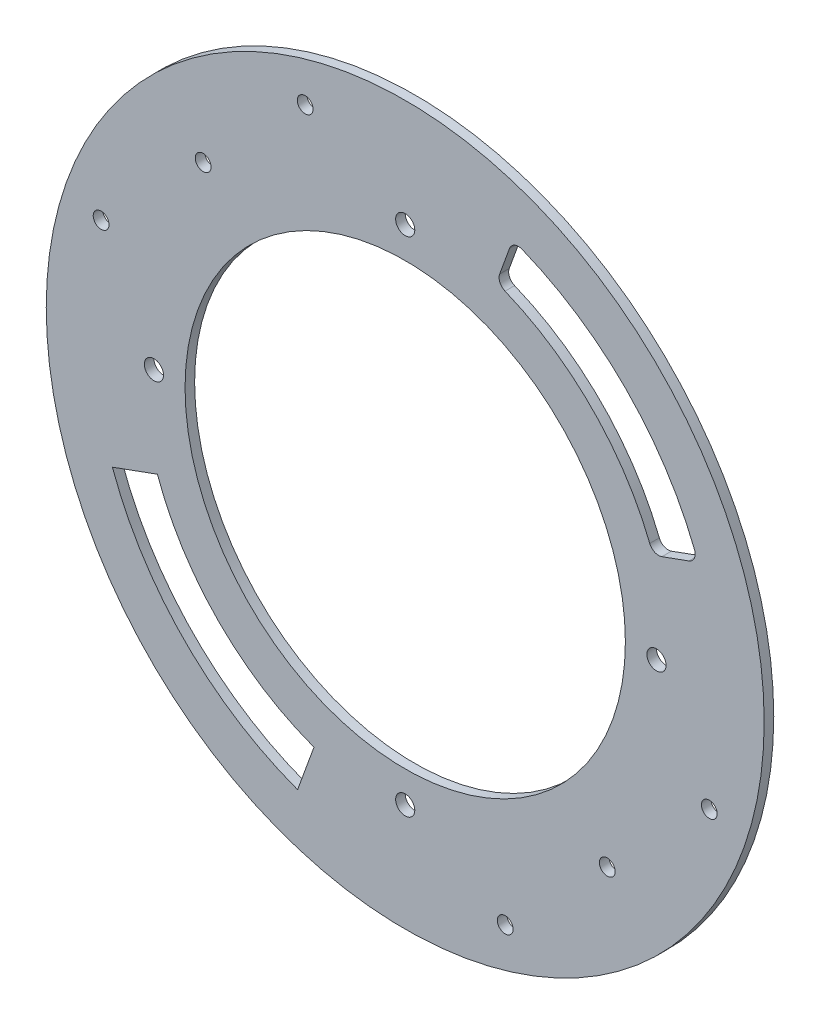
ISO-10303-21;
HEADER;
FILE_DESCRIPTION(('STEP AP214'),'2;1');
FILE_NAME('part.step','',(''),(''),'','','');
FILE_SCHEMA(('AUTOMOTIVE_DESIGN { 1 0 10303 214 1 1 1 1 }'));
ENDSEC;
DATA;
#1=APPLICATION_CONTEXT('core data for automotive mechanical design processes');
#2=APPLICATION_PROTOCOL_DEFINITION('international standard','automotive_design',2000,#1);
#3=PRODUCT_CONTEXT('',#1,'mechanical');
#4=PRODUCT('Part','Part','',(#3));
#5=PRODUCT_RELATED_PRODUCT_CATEGORY('part','',(#4));
#6=PRODUCT_DEFINITION_FORMATION('','',#4);
#7=PRODUCT_DEFINITION_CONTEXT('part definition',#1,'design');
#8=PRODUCT_DEFINITION('design','',#6,#7);
#9=PRODUCT_DEFINITION_SHAPE('','',#8);
#10=(LENGTH_UNIT() NAMED_UNIT(*) SI_UNIT(.MILLI.,.METRE.));
#11=(NAMED_UNIT(*) PLANE_ANGLE_UNIT() SI_UNIT($,.RADIAN.));
#12=(NAMED_UNIT(*) SI_UNIT($,.STERADIAN.) SOLID_ANGLE_UNIT());
#13=UNCERTAINTY_MEASURE_WITH_UNIT(LENGTH_MEASURE(1.E-05),#10,'distance_accuracy_value','');
#14=(GEOMETRIC_REPRESENTATION_CONTEXT(3) GLOBAL_UNCERTAINTY_ASSIGNED_CONTEXT((#13)) GLOBAL_UNIT_ASSIGNED_CONTEXT((#10,
#11,#12)) REPRESENTATION_CONTEXT('',''));
#15=CARTESIAN_POINT('',(0.,0.,0.));
#16=DIRECTION('',(0.,0.,1.));
#17=DIRECTION('',(1.,0.,0.));
#18=AXIS2_PLACEMENT_3D('',#15,#16,#17);
#19=CARTESIAN_POINT('',(0.,0.,2.));
#20=DIRECTION('',(0.,0.,1.));
#21=DIRECTION('',(1.,0.,0.));
#22=AXIS2_PLACEMENT_3D('',#19,#20,#21);
#23=PLANE('',#22);
#24=CARTESIAN_POINT('',(63.5341276300229,-21.5270672942682,2.));
#25=DIRECTION('',(0.,0.,1.));
#26=DIRECTION('',(-1.,0.,0.));
#27=AXIS2_PLACEMENT_3D('',#24,#25,#26);
#28=CIRCLE('',#27,1.64999999999999);
#29=CARTESIAN_POINT('',(61.884127630023,-21.5270672942682,2.));
#30=VERTEX_POINT('',#29);
#31=EDGE_CURVE('E232',#30,#30,#28,.T.);
#32=ORIENTED_EDGE('',*,*,#31,.F.);
#33=EDGE_LOOP('',(#32));
#34=FACE_BOUND('',#33,.T.);
#35=CARTESIAN_POINT('',(-63.5341276300229,21.5270672942682,2.));
#36=DIRECTION('',(0.,0.,1.));
#37=DIRECTION('',(1.,0.,0.));
#38=AXIS2_PLACEMENT_3D('',#35,#36,#37);
#39=CIRCLE('',#38,1.65);
#40=CARTESIAN_POINT('',(-61.8841276300229,21.5270672942682,2.));
#41=VERTEX_POINT('',#40);
#42=EDGE_CURVE('E590',#41,#41,#39,.T.);
#43=ORIENTED_EDGE('',*,*,#42,.F.);
#44=EDGE_LOOP('',(#43));
#45=FACE_BOUND('',#44,.T.);
#46=CARTESIAN_POINT('',(-42.2164751863111,42.6353048874238,2.));
#47=DIRECTION('',(0.,0.,1.));
#48=DIRECTION('',(1.,0.,0.));
#49=AXIS2_PLACEMENT_3D('',#46,#47,#48);
#50=CIRCLE('',#49,1.65);
#51=CARTESIAN_POINT('',(-40.5664751863111,42.6353048874238,2.));
#52=VERTEX_POINT('',#51);
#53=EDGE_CURVE('E587',#52,#52,#50,.T.);
#54=ORIENTED_EDGE('',*,*,#53,.F.);
#55=EDGE_LOOP('',(#54));
#56=FACE_BOUND('',#55,.T.);
#57=CARTESIAN_POINT('',(-20.8988227425992,63.7435424805793,2.));
#58=DIRECTION('',(0.,0.,1.));
#59=DIRECTION('',(1.,0.,0.));
#60=AXIS2_PLACEMENT_3D('',#57,#58,#59);
#61=CIRCLE('',#60,1.65);
#62=CARTESIAN_POINT('',(-19.2488227425992,63.7435424805793,2.));
#63=VERTEX_POINT('',#62);
#64=EDGE_CURVE('E584',#63,#63,#61,.T.);
#65=ORIENTED_EDGE('',*,*,#64,.F.);
#66=EDGE_LOOP('',(#65));
#67=FACE_BOUND('',#66,.T.);
#68=CARTESIAN_POINT('',(42.2164751863111,-42.6353048874238,2.));
#69=DIRECTION('',(0.,0.,1.));
#70=DIRECTION('',(-1.,0.,0.));
#71=AXIS2_PLACEMENT_3D('',#68,#69,#70);
#72=CIRCLE('',#71,1.65000000000001);
#73=CARTESIAN_POINT('',(40.566475186311,-42.6353048874238,2.));
#74=VERTEX_POINT('',#73);
#75=EDGE_CURVE('E581',#74,#74,#72,.T.);
#76=ORIENTED_EDGE('',*,*,#75,.F.);
#77=EDGE_LOOP('',(#76));
#78=FACE_BOUND('',#77,.T.);
#79=CARTESIAN_POINT('',(20.8988227425991,-63.7435424805793,2.));
#80=DIRECTION('',(0.,0.,1.));
#81=DIRECTION('',(-1.,0.,0.));
#82=AXIS2_PLACEMENT_3D('',#79,#80,#81);
#83=CIRCLE('',#82,1.65000000000001);
#84=CARTESIAN_POINT('',(19.2488227425991,-63.7435424805793,2.));
#85=VERTEX_POINT('',#84);
#86=EDGE_CURVE('E578',#85,#85,#83,.T.);
#87=ORIENTED_EDGE('',*,*,#86,.F.);
#88=EDGE_LOOP('',(#87));
#89=FACE_BOUND('',#88,.T.);
#90=CARTESIAN_POINT('',(0.,0.,2.));
#91=DIRECTION('',(0.,0.,-1.));
#92=DIRECTION('',(1.,0.,0.));
#93=AXIS2_PLACEMENT_3D('',#90,#91,#92);
#94=CIRCLE('',#93,55.);
#95=CARTESIAN_POINT('',(-19.0641631105005,-51.5902867301223,2.));
#96=VERTEX_POINT('',#95);
#97=CARTESIAN_POINT('',(-51.7759702978787,-18.5539456642836,2.));
#98=VERTEX_POINT('',#97);
#99=EDGE_CURVE('E147',#96,#98,#94,.T.);
#100=ORIENTED_EDGE('',*,*,#99,.F.);
#101=DIRECTION('',(0.342020143325669,0.939692620785908,0.));
#102=VECTOR('',#101,1.);
#103=CARTESIAN_POINT('',(-19.0641631105005,-51.5902867301223,2.));
#104=LINE('',#103,#102);
#105=CARTESIAN_POINT('',(-22.4843992962783,-60.9873084197485,2.));
#106=VERTEX_POINT('',#105);
#107=EDGE_CURVE('E151',#106,#96,#104,.T.);
#108=ORIENTED_EDGE('',*,*,#107,.F.);
#109=CARTESIAN_POINT('',(0.,0.,2.));
#110=DIRECTION('',(0.,0.,1.));
#111=DIRECTION('',(1.,0.,0.));
#112=AXIS2_PLACEMENT_3D('',#109,#110,#111);
#113=CIRCLE('',#112,65.);
#114=CARTESIAN_POINT('',(-61.1729947583006,-21.9741828585486,2.));
#115=VERTEX_POINT('',#114);
#116=EDGE_CURVE('E131',#115,#106,#113,.T.);
#117=ORIENTED_EDGE('',*,*,#116,.F.);
#118=DIRECTION('',(-0.939692620785908,-0.342020143325669,0.));
#119=VECTOR('',#118,1.);
#120=CARTESIAN_POINT('',(-51.7759702978787,-18.5539456642836,2.));
#121=LINE('',#120,#119);
#122=EDGE_CURVE('E142',#98,#115,#121,.T.);
#123=ORIENTED_EDGE('',*,*,#122,.F.);
#124=EDGE_LOOP('',(#100,#108,#117,#123));
#125=FACE_BOUND('',#124,.T.);
#126=CARTESIAN_POINT('',(0.,0.,2.));
#127=DIRECTION('',(0.,0.,-1.));
#128=DIRECTION('',(1.,0.,0.));
#129=AXIS2_PLACEMENT_3D('',#126,#127,#128);
#130=CIRCLE('',#129,55.);
#131=CARTESIAN_POINT('',(20.8540268561821,50.8931190229253,2.));
#132=VERTEX_POINT('',#131);
#133=CARTESIAN_POINT('',(51.0895727877265,20.3680031512074,2.));
#134=VERTEX_POINT('',#133);
#135=EDGE_CURVE('E161',#132,#134,#130,.T.);
#136=ORIENTED_EDGE('',*,*,#135,.F.);
#137=CARTESIAN_POINT('',(21.6123551054978,52.7437778964862,2.));
#138=DIRECTION('',(0.,0.,1.));
#139=DIRECTION('',(1.,0.,0.));
#140=AXIS2_PLACEMENT_3D('',#137,#138,#139);
#141=CIRCLE('',#140,2.);
#142=CARTESIAN_POINT('',(19.732969863926,53.4278181831375,2.));
#143=VERTEX_POINT('',#142);
#144=EDGE_CURVE('E268',#132,#143,#141,.F.);
#145=ORIENTED_EDGE('',*,*,#144,.T.);
#146=DIRECTION('',(-0.342020143325668,-0.939692620785909,0.));
#147=VECTOR('',#146,1.);
#148=CARTESIAN_POINT('',(19.0641631105005,51.5902867301223,2.));
#149=LINE('',#148,#147);
#150=CARTESIAN_POINT('',(21.7865640565263,59.0700218560302,2.));
#151=VERTEX_POINT('',#150);
#152=EDGE_CURVE('E170',#151,#143,#149,.T.);
#153=ORIENTED_EDGE('',*,*,#152,.F.);
#154=CARTESIAN_POINT('',(23.6659492980981,58.3859815693789,2.));
#155=DIRECTION('',(0.,0.,1.));
#156=DIRECTION('',(1.,0.,0.));
#157=AXIS2_PLACEMENT_3D('',#154,#155,#156);
#158=CIRCLE('',#157,2.);
#159=CARTESIAN_POINT('',(24.4172492758155,60.2395047938036,2.));
#160=VERTEX_POINT('',#159);
#161=EDGE_CURVE('E44',#151,#160,#158,.F.);
#162=ORIENTED_EDGE('',*,*,#161,.T.);
#163=CARTESIAN_POINT('',(0.,0.,2.));
#164=DIRECTION('',(0.,0.,1.));
#165=DIRECTION('',(1.,0.,0.));
#166=AXIS2_PLACEMENT_3D('',#163,#164,#165);
#167=CIRCLE('',#166,65.);
#168=CARTESIAN_POINT('',(60.4478053630012,23.8969208643442,2.));
#169=VERTEX_POINT('',#168);
#170=EDGE_CURVE('E168',#169,#160,#167,.T.);
#171=ORIENTED_EDGE('',*,*,#170,.F.);
#172=CARTESIAN_POINT('',(58.5878728902934,23.1616309915952,2.));
#173=DIRECTION('',(0.,0.,1.));
#174=DIRECTION('',(1.,0.,0.));
#175=AXIS2_PLACEMENT_3D('',#172,#173,#174);
#176=CIRCLE('',#175,2.);
#177=CARTESIAN_POINT('',(59.2719131769448,21.2822457500233,2.));
#178=VERTEX_POINT('',#177);
#179=EDGE_CURVE('E272',#169,#178,#176,.F.);
#180=ORIENTED_EDGE('',*,*,#179,.T.);
#181=DIRECTION('',(0.939692620785908,0.342020143325669,0.));
#182=VECTOR('',#181,1.);
#183=CARTESIAN_POINT('',(51.7759702978787,18.5539456642836,2.));
#184=LINE('',#183,#182);
#185=CARTESIAN_POINT('',(53.6314157212042,19.2292725696795,2.));
#186=VERTEX_POINT('',#185);
#187=EDGE_CURVE('E164',#186,#178,#184,.T.);
#188=ORIENTED_EDGE('',*,*,#187,.F.);
#189=CARTESIAN_POINT('',(52.9473754345529,21.1086578112514,2.));
#190=DIRECTION('',(0.,0.,1.));
#191=DIRECTION('',(1.,0.,0.));
#192=AXIS2_PLACEMENT_3D('',#189,#190,#191);
#193=CIRCLE('',#192,2.);
#194=EDGE_CURVE('E264',#186,#134,#193,.F.);
#195=ORIENTED_EDGE('',*,*,#194,.T.);
#196=EDGE_LOOP('',(#136,#145,#153,#162,#171,#180,#188,#195));
#197=FACE_BOUND('',#196,.T.);
#198=CARTESIAN_POINT('',(52.5,0.,2.));
#199=DIRECTION('',(0.,0.,1.));
#200=DIRECTION('',(1.,0.,0.));
#201=AXIS2_PLACEMENT_3D('',#198,#199,#200);
#202=CIRCLE('',#201,2.);
#203=CARTESIAN_POINT('',(54.5,0.,2.));
#204=VERTEX_POINT('',#203);
#205=EDGE_CURVE('E179',#204,#204,#202,.T.);
#206=ORIENTED_EDGE('',*,*,#205,.F.);
#207=EDGE_LOOP('',(#206));
#208=FACE_BOUND('',#207,.T.);
#209=CARTESIAN_POINT('',(0.,0.,2.));
#210=DIRECTION('',(0.,0.,1.));
#211=DIRECTION('',(1.,0.,0.));
#212=AXIS2_PLACEMENT_3D('',#209,#210,#211);
#213=CIRCLE('',#212,46.);
#214=CARTESIAN_POINT('',(46.,0.,2.));
#215=VERTEX_POINT('',#214);
#216=EDGE_CURVE('E191',#215,#215,#213,.T.);
#217=ORIENTED_EDGE('',*,*,#216,.F.);
#218=EDGE_LOOP('',(#217));
#219=FACE_BOUND('',#218,.T.);
#220=CARTESIAN_POINT('',(0.,0.,2.));
#221=DIRECTION('',(0.,0.,1.));
#222=DIRECTION('',(1.,0.,0.));
#223=AXIS2_PLACEMENT_3D('',#220,#221,#222);
#224=CIRCLE('',#223,75.);
#225=CARTESIAN_POINT('',(75.,0.,2.));
#226=VERTEX_POINT('',#225);
#227=EDGE_CURVE('E203',#226,#226,#224,.T.);
#228=ORIENTED_EDGE('',*,*,#227,.T.);
#229=EDGE_LOOP('',(#228));
#230=FACE_BOUND('',#229,.T.);
#231=CARTESIAN_POINT('',(-52.5,0.,2.));
#232=DIRECTION('',(0.,0.,1.));
#233=DIRECTION('',(1.,0.,0.));
#234=AXIS2_PLACEMENT_3D('',#231,#232,#233);
#235=CIRCLE('',#234,2.);
#236=CARTESIAN_POINT('',(-50.5,0.,2.));
#237=VERTEX_POINT('',#236);
#238=EDGE_CURVE('E197',#237,#237,#235,.T.);
#239=ORIENTED_EDGE('',*,*,#238,.F.);
#240=EDGE_LOOP('',(#239));
#241=FACE_BOUND('',#240,.T.);
#242=CARTESIAN_POINT('',(0.,52.5,2.));
#243=DIRECTION('',(0.,0.,1.));
#244=DIRECTION('',(1.,0.,0.));
#245=AXIS2_PLACEMENT_3D('',#242,#243,#244);
#246=CIRCLE('',#245,2.);
#247=CARTESIAN_POINT('',(2.,52.5,2.));
#248=VERTEX_POINT('',#247);
#249=EDGE_CURVE('E185',#248,#248,#246,.T.);
#250=ORIENTED_EDGE('',*,*,#249,.F.);
#251=EDGE_LOOP('',(#250));
#252=FACE_BOUND('',#251,.T.);
#253=CARTESIAN_POINT('',(0.,-52.5,2.));
#254=DIRECTION('',(0.,0.,1.));
#255=DIRECTION('',(1.,0.,0.));
#256=AXIS2_PLACEMENT_3D('',#253,#254,#255);
#257=CIRCLE('',#256,2.);
#258=CARTESIAN_POINT('',(2.00000000000001,-52.5,2.));
#259=VERTEX_POINT('',#258);
#260=EDGE_CURVE('E173',#259,#259,#257,.T.);
#261=ORIENTED_EDGE('',*,*,#260,.F.);
#262=EDGE_LOOP('',(#261));
#263=FACE_BOUND('',#262,.T.);
#264=ADVANCED_FACE('F36',(#34,#45,#56,#67,#78,#89,#125,#197,#208,#219,#230,#241,#252,#263),#23,.T.);
#265=CARTESIAN_POINT('',(0.,0.,0.));
#266=DIRECTION('',(0.,0.,1.));
#267=DIRECTION('',(1.,0.,0.));
#268=AXIS2_PLACEMENT_3D('',#265,#266,#267);
#269=PLANE('',#268);
#270=CARTESIAN_POINT('',(63.5341276300229,-21.5270672942682,0.));
#271=DIRECTION('',(0.,0.,1.));
#272=DIRECTION('',(1.,0.,0.));
#273=AXIS2_PLACEMENT_3D('',#270,#271,#272);
#274=CIRCLE('',#273,1.64999999999999);
#275=CARTESIAN_POINT('',(65.1841276300229,-21.5270672942682,0.));
#276=VERTEX_POINT('',#275);
#277=EDGE_CURVE('E165',#276,#276,#274,.T.);
#278=ORIENTED_EDGE('',*,*,#277,.T.);
#279=EDGE_LOOP('',(#278));
#280=FACE_BOUND('',#279,.T.);
#281=CARTESIAN_POINT('',(-63.5341276300229,21.5270672942682,0.));
#282=DIRECTION('',(0.,0.,1.));
#283=DIRECTION('',(1.,0.,0.));
#284=AXIS2_PLACEMENT_3D('',#281,#282,#283);
#285=CIRCLE('',#284,1.65);
#286=CARTESIAN_POINT('',(-61.8841276300229,21.5270672942682,0.));
#287=VERTEX_POINT('',#286);
#288=EDGE_CURVE('E241',#287,#287,#285,.T.);
#289=ORIENTED_EDGE('',*,*,#288,.T.);
#290=EDGE_LOOP('',(#289));
#291=FACE_BOUND('',#290,.T.);
#292=CARTESIAN_POINT('',(-42.2164751863111,42.6353048874238,0.));
#293=DIRECTION('',(0.,0.,1.));
#294=DIRECTION('',(1.,0.,0.));
#295=AXIS2_PLACEMENT_3D('',#292,#293,#294);
#296=CIRCLE('',#295,1.65);
#297=CARTESIAN_POINT('',(-40.5664751863111,42.6353048874238,0.));
#298=VERTEX_POINT('',#297);
#299=EDGE_CURVE('E238',#298,#298,#296,.T.);
#300=ORIENTED_EDGE('',*,*,#299,.T.);
#301=EDGE_LOOP('',(#300));
#302=FACE_BOUND('',#301,.T.);
#303=CARTESIAN_POINT('',(-20.8988227425992,63.7435424805793,0.));
#304=DIRECTION('',(0.,0.,1.));
#305=DIRECTION('',(1.,0.,0.));
#306=AXIS2_PLACEMENT_3D('',#303,#304,#305);
#307=CIRCLE('',#306,1.65);
#308=CARTESIAN_POINT('',(-19.2488227425992,63.7435424805793,0.));
#309=VERTEX_POINT('',#308);
#310=EDGE_CURVE('E235',#309,#309,#307,.T.);
#311=ORIENTED_EDGE('',*,*,#310,.T.);
#312=EDGE_LOOP('',(#311));
#313=FACE_BOUND('',#312,.T.);
#314=CARTESIAN_POINT('',(42.2164751863111,-42.6353048874238,0.));
#315=DIRECTION('',(0.,0.,1.));
#316=DIRECTION('',(1.,0.,0.));
#317=AXIS2_PLACEMENT_3D('',#314,#315,#316);
#318=CIRCLE('',#317,1.65000000000001);
#319=CARTESIAN_POINT('',(43.8664751863111,-42.6353048874238,0.));
#320=VERTEX_POINT('',#319);
#321=EDGE_CURVE('E231',#320,#320,#318,.T.);
#322=ORIENTED_EDGE('',*,*,#321,.T.);
#323=EDGE_LOOP('',(#322));
#324=FACE_BOUND('',#323,.T.);
#325=CARTESIAN_POINT('',(20.8988227425991,-63.7435424805793,0.));
#326=DIRECTION('',(0.,0.,1.));
#327=DIRECTION('',(1.,0.,0.));
#328=AXIS2_PLACEMENT_3D('',#325,#326,#327);
#329=CIRCLE('',#328,1.65000000000001);
#330=CARTESIAN_POINT('',(22.5488227425992,-63.7435424805793,0.));
#331=VERTEX_POINT('',#330);
#332=EDGE_CURVE('E228',#331,#331,#329,.T.);
#333=ORIENTED_EDGE('',*,*,#332,.T.);
#334=EDGE_LOOP('',(#333));
#335=FACE_BOUND('',#334,.T.);
#336=DIRECTION('',(0.342020143325669,0.939692620785908,0.));
#337=VECTOR('',#336,1.);
#338=CARTESIAN_POINT('',(-0.253281116857345,0.0921867874377732,0.));
#339=LINE('',#338,#337);
#340=CARTESIAN_POINT('',(-22.4843992962783,-60.9873084197485,0.));
#341=VERTEX_POINT('',#340);
#342=CARTESIAN_POINT('',(-19.0641631105005,-51.5902867301223,0.));
#343=VERTEX_POINT('',#342);
#344=EDGE_CURVE('E221',#341,#343,#339,.T.);
#345=ORIENTED_EDGE('',*,*,#344,.T.);
#346=CARTESIAN_POINT('',(0.,0.,0.));
#347=DIRECTION('',(0.,0.,1.));
#348=DIRECTION('',(1.,0.,0.));
#349=AXIS2_PLACEMENT_3D('',#346,#347,#348);
#350=CIRCLE('',#349,55.);
#351=CARTESIAN_POINT('',(-51.7759702978787,-18.5539456642836,0.));
#352=VERTEX_POINT('',#351);
#353=EDGE_CURVE('E224',#343,#352,#350,.F.);
#354=ORIENTED_EDGE('',*,*,#353,.T.);
#355=DIRECTION('',(-0.939692620785908,-0.342020143325669,0.));
#356=VECTOR('',#355,1.);
#357=CARTESIAN_POINT('',(-0.0935147901483396,0.256929774317601,0.));
#358=LINE('',#357,#356);
#359=CARTESIAN_POINT('',(-61.1729947583006,-21.9741828585486,0.));
#360=VERTEX_POINT('',#359);
#361=EDGE_CURVE('E218',#352,#360,#358,.T.);
#362=ORIENTED_EDGE('',*,*,#361,.T.);
#363=CARTESIAN_POINT('',(0.,0.,0.));
#364=DIRECTION('',(0.,0.,1.));
#365=DIRECTION('',(1.,0.,0.));
#366=AXIS2_PLACEMENT_3D('',#363,#364,#365);
#367=CIRCLE('',#366,65.);
#368=EDGE_CURVE('E134',#360,#341,#367,.T.);
#369=ORIENTED_EDGE('',*,*,#368,.T.);
#370=EDGE_LOOP('',(#345,#354,#362,#369));
#371=FACE_BOUND('',#370,.T.);
#372=CARTESIAN_POINT('',(0.,0.,0.));
#373=DIRECTION('',(0.,0.,1.));
#374=DIRECTION('',(1.,0.,0.));
#375=AXIS2_PLACEMENT_3D('',#372,#373,#374);
#376=CIRCLE('',#375,65.);
#377=CARTESIAN_POINT('',(60.4478053630012,23.8969208643442,0.));
#378=VERTEX_POINT('',#377);
#379=CARTESIAN_POINT('',(24.4172492758155,60.2395047938036,0.));
#380=VERTEX_POINT('',#379);
#381=EDGE_CURVE('E210',#378,#380,#376,.T.);
#382=ORIENTED_EDGE('',*,*,#381,.T.);
#383=CARTESIAN_POINT('',(23.6659492980981,58.3859815693789,0.));
#384=DIRECTION('',(0.,0.,1.));
#385=DIRECTION('',(1.,0.,0.));
#386=AXIS2_PLACEMENT_3D('',#383,#384,#385);
#387=CIRCLE('',#386,2.);
#388=CARTESIAN_POINT('',(21.7865640565263,59.0700218560302,0.));
#389=VERTEX_POINT('',#388);
#390=EDGE_CURVE('E11',#380,#389,#387,.T.);
#391=ORIENTED_EDGE('',*,*,#390,.T.);
#392=DIRECTION('',(-0.342020143325668,-0.939692620785909,0.));
#393=VECTOR('',#392,1.);
#394=CARTESIAN_POINT('',(0.253281116857397,-0.0921867874377919,0.));
#395=LINE('',#394,#393);
#396=CARTESIAN_POINT('',(19.732969863926,53.4278181831375,0.));
#397=VERTEX_POINT('',#396);
#398=EDGE_CURVE('E212',#389,#397,#395,.T.);
#399=ORIENTED_EDGE('',*,*,#398,.T.);
#400=CARTESIAN_POINT('',(21.6123551054978,52.7437778964862,0.));
#401=DIRECTION('',(0.,0.,1.));
#402=DIRECTION('',(1.,0.,0.));
#403=AXIS2_PLACEMENT_3D('',#400,#401,#402);
#404=CIRCLE('',#403,2.);
#405=CARTESIAN_POINT('',(20.8540268561821,50.8931190229253,0.));
#406=VERTEX_POINT('',#405);
#407=EDGE_CURVE('E270',#397,#406,#404,.T.);
#408=ORIENTED_EDGE('',*,*,#407,.T.);
#409=CARTESIAN_POINT('',(0.,0.,0.));
#410=DIRECTION('',(0.,0.,1.));
#411=DIRECTION('',(1.,0.,0.));
#412=AXIS2_PLACEMENT_3D('',#409,#410,#411);
#413=CIRCLE('',#412,55.);
#414=CARTESIAN_POINT('',(51.0895727877265,20.3680031512074,0.));
#415=VERTEX_POINT('',#414);
#416=EDGE_CURVE('E215',#406,#415,#413,.F.);
#417=ORIENTED_EDGE('',*,*,#416,.T.);
#418=CARTESIAN_POINT('',(52.9473754345529,21.1086578112514,0.));
#419=DIRECTION('',(0.,0.,1.));
#420=DIRECTION('',(1.,0.,0.));
#421=AXIS2_PLACEMENT_3D('',#418,#419,#420);
#422=CIRCLE('',#421,2.);
#423=CARTESIAN_POINT('',(53.6314157212042,19.2292725696795,0.));
#424=VERTEX_POINT('',#423);
#425=EDGE_CURVE('E266',#415,#424,#422,.T.);
#426=ORIENTED_EDGE('',*,*,#425,.T.);
#427=DIRECTION('',(0.939692620785908,0.342020143325669,0.));
#428=VECTOR('',#427,1.);
#429=CARTESIAN_POINT('',(0.0935147901483456,-0.256929774317617,0.));
#430=LINE('',#429,#428);
#431=CARTESIAN_POINT('',(59.2719131769448,21.2822457500233,0.));
#432=VERTEX_POINT('',#431);
#433=EDGE_CURVE('E206',#424,#432,#430,.T.);
#434=ORIENTED_EDGE('',*,*,#433,.T.);
#435=CARTESIAN_POINT('',(58.5878728902934,23.1616309915952,0.));
#436=DIRECTION('',(0.,0.,1.));
#437=DIRECTION('',(1.,0.,0.));
#438=AXIS2_PLACEMENT_3D('',#435,#436,#437);
#439=CIRCLE('',#438,2.);
#440=EDGE_CURVE('E58',#432,#378,#439,.T.);
#441=ORIENTED_EDGE('',*,*,#440,.T.);
#442=EDGE_LOOP('',(#382,#391,#399,#408,#417,#426,#434,#441));
#443=FACE_BOUND('',#442,.T.);
#444=CARTESIAN_POINT('',(0.,0.,0.));
#445=DIRECTION('',(0.,0.,1.));
#446=DIRECTION('',(1.,0.,0.));
#447=AXIS2_PLACEMENT_3D('',#444,#445,#446);
#448=CIRCLE('',#447,75.);
#449=CARTESIAN_POINT('',(75.,0.,0.));
#450=VERTEX_POINT('',#449);
#451=EDGE_CURVE('E200',#450,#450,#448,.T.);
#452=ORIENTED_EDGE('',*,*,#451,.F.);
#453=EDGE_LOOP('',(#452));
#454=FACE_BOUND('',#453,.T.);
#455=CARTESIAN_POINT('',(-52.5,0.,0.));
#456=DIRECTION('',(0.,0.,1.));
#457=DIRECTION('',(1.,0.,0.));
#458=AXIS2_PLACEMENT_3D('',#455,#456,#457);
#459=CIRCLE('',#458,2.);
#460=CARTESIAN_POINT('',(-50.5,0.,0.));
#461=VERTEX_POINT('',#460);
#462=EDGE_CURVE('E194',#461,#461,#459,.T.);
#463=ORIENTED_EDGE('',*,*,#462,.T.);
#464=EDGE_LOOP('',(#463));
#465=FACE_BOUND('',#464,.T.);
#466=CARTESIAN_POINT('',(0.,0.,0.));
#467=DIRECTION('',(0.,0.,1.));
#468=DIRECTION('',(1.,0.,0.));
#469=AXIS2_PLACEMENT_3D('',#466,#467,#468);
#470=CIRCLE('',#469,46.);
#471=CARTESIAN_POINT('',(46.,0.,0.));
#472=VERTEX_POINT('',#471);
#473=EDGE_CURVE('E188',#472,#472,#470,.T.);
#474=ORIENTED_EDGE('',*,*,#473,.T.);
#475=EDGE_LOOP('',(#474));
#476=FACE_BOUND('',#475,.T.);
#477=CARTESIAN_POINT('',(0.,52.5,0.));
#478=DIRECTION('',(0.,0.,1.));
#479=DIRECTION('',(1.,0.,0.));
#480=AXIS2_PLACEMENT_3D('',#477,#478,#479);
#481=CIRCLE('',#480,2.);
#482=CARTESIAN_POINT('',(2.,52.5,0.));
#483=VERTEX_POINT('',#482);
#484=EDGE_CURVE('E182',#483,#483,#481,.T.);
#485=ORIENTED_EDGE('',*,*,#484,.T.);
#486=EDGE_LOOP('',(#485));
#487=FACE_BOUND('',#486,.T.);
#488=CARTESIAN_POINT('',(52.5,0.,0.));
#489=DIRECTION('',(0.,0.,1.));
#490=DIRECTION('',(1.,0.,0.));
#491=AXIS2_PLACEMENT_3D('',#488,#489,#490);
#492=CIRCLE('',#491,2.);
#493=CARTESIAN_POINT('',(54.5,0.,0.));
#494=VERTEX_POINT('',#493);
#495=EDGE_CURVE('E176',#494,#494,#492,.T.);
#496=ORIENTED_EDGE('',*,*,#495,.T.);
#497=EDGE_LOOP('',(#496));
#498=FACE_BOUND('',#497,.T.);
#499=CARTESIAN_POINT('',(0.,-52.5,0.));
#500=DIRECTION('',(0.,0.,1.));
#501=DIRECTION('',(1.,0.,0.));
#502=AXIS2_PLACEMENT_3D('',#499,#500,#501);
#503=CIRCLE('',#502,2.);
#504=CARTESIAN_POINT('',(2.00000000000001,-52.5,0.));
#505=VERTEX_POINT('',#504);
#506=EDGE_CURVE('E158',#505,#505,#503,.T.);
#507=ORIENTED_EDGE('',*,*,#506,.T.);
#508=EDGE_LOOP('',(#507));
#509=FACE_BOUND('',#508,.T.);
#510=ADVANCED_FACE('F284',(#280,#291,#302,#313,#324,#335,#371,#443,#454,#465,#476,#487,#498,
#509),#269,.F.);
#511=CARTESIAN_POINT('',(0.,0.,2.));
#512=DIRECTION('',(0.,0.,-1.));
#513=DIRECTION('',(-1.,0.,0.));
#514=AXIS2_PLACEMENT_3D('',#511,#512,#513);
#515=CYLINDRICAL_SURFACE('',#514,75.);
#516=ORIENTED_EDGE('',*,*,#227,.F.);
#517=EDGE_LOOP('',(#516));
#518=FACE_BOUND('',#517,.T.);
#519=ORIENTED_EDGE('',*,*,#451,.T.);
#520=EDGE_LOOP('',(#519));
#521=FACE_BOUND('',#520,.T.);
#522=ADVANCED_FACE('F320',(#518,#521),#515,.T.);
#523=CARTESIAN_POINT('',(-52.5,0.,2.));
#524=DIRECTION('',(0.,0.,-1.));
#525=DIRECTION('',(-1.,0.,0.));
#526=AXIS2_PLACEMENT_3D('',#523,#524,#525);
#527=CYLINDRICAL_SURFACE('',#526,2.);
#528=ORIENTED_EDGE('',*,*,#238,.T.);
#529=EDGE_LOOP('',(#528));
#530=FACE_BOUND('',#529,.T.);
#531=ORIENTED_EDGE('',*,*,#462,.F.);
#532=EDGE_LOOP('',(#531));
#533=FACE_BOUND('',#532,.T.);
#534=ADVANCED_FACE('F326',(#530,#533),#527,.F.);
#535=CARTESIAN_POINT('',(0.,0.,2.));
#536=DIRECTION('',(0.,0.,-1.));
#537=DIRECTION('',(-1.,0.,0.));
#538=AXIS2_PLACEMENT_3D('',#535,#536,#537);
#539=CYLINDRICAL_SURFACE('',#538,46.);
#540=ORIENTED_EDGE('',*,*,#216,.T.);
#541=EDGE_LOOP('',(#540));
#542=FACE_BOUND('',#541,.T.);
#543=ORIENTED_EDGE('',*,*,#473,.F.);
#544=EDGE_LOOP('',(#543));
#545=FACE_BOUND('',#544,.T.);
#546=ADVANCED_FACE('F394',(#542,#545),#539,.F.);
#547=CARTESIAN_POINT('',(0.,52.5,2.));
#548=DIRECTION('',(0.,0.,-1.));
#549=DIRECTION('',(-1.,0.,0.));
#550=AXIS2_PLACEMENT_3D('',#547,#548,#549);
#551=CYLINDRICAL_SURFACE('',#550,2.);
#552=ORIENTED_EDGE('',*,*,#249,.T.);
#553=EDGE_LOOP('',(#552));
#554=FACE_BOUND('',#553,.T.);
#555=ORIENTED_EDGE('',*,*,#484,.F.);
#556=EDGE_LOOP('',(#555));
#557=FACE_BOUND('',#556,.T.);
#558=ADVANCED_FACE('F391',(#554,#557),#551,.F.);
#559=CARTESIAN_POINT('',(52.5,0.,2.));
#560=DIRECTION('',(0.,0.,-1.));
#561=DIRECTION('',(-1.,0.,0.));
#562=AXIS2_PLACEMENT_3D('',#559,#560,#561);
#563=CYLINDRICAL_SURFACE('',#562,2.);
#564=ORIENTED_EDGE('',*,*,#205,.T.);
#565=EDGE_LOOP('',(#564));
#566=FACE_BOUND('',#565,.T.);
#567=ORIENTED_EDGE('',*,*,#495,.F.);
#568=EDGE_LOOP('',(#567));
#569=FACE_BOUND('',#568,.T.);
#570=ADVANCED_FACE('F387',(#566,#569),#563,.F.);
#571=CARTESIAN_POINT('',(0.,-52.5,2.));
#572=DIRECTION('',(0.,0.,-1.));
#573=DIRECTION('',(-1.,0.,0.));
#574=AXIS2_PLACEMENT_3D('',#571,#572,#573);
#575=CYLINDRICAL_SURFACE('',#574,2.);
#576=ORIENTED_EDGE('',*,*,#260,.T.);
#577=EDGE_LOOP('',(#576));
#578=FACE_BOUND('',#577,.T.);
#579=ORIENTED_EDGE('',*,*,#506,.F.);
#580=EDGE_LOOP('',(#579));
#581=FACE_BOUND('',#580,.T.);
#582=ADVANCED_FACE('F384',(#578,#581),#575,.F.);
#583=CARTESIAN_POINT('',(0.,0.,-8.));
#584=DIRECTION('',(0.,0.,1.));
#585=DIRECTION('',(1.,0.,0.));
#586=AXIS2_PLACEMENT_3D('',#583,#584,#585);
#587=CYLINDRICAL_SURFACE('',#586,55.);
#588=ORIENTED_EDGE('',*,*,#135,.T.);
#589=DIRECTION('',(0.,0.,1.));
#590=VECTOR('',#589,1.);
#591=CARTESIAN_POINT('',(51.0895727877265,20.3680031512074,-8.));
#592=LINE('',#591,#590);
#593=EDGE_CURVE('E253',#134,#415,#592,.F.);
#594=ORIENTED_EDGE('',*,*,#593,.T.);
#595=ORIENTED_EDGE('',*,*,#416,.F.);
#596=DIRECTION('',(0.,0.,1.));
#597=VECTOR('',#596,1.);
#598=CARTESIAN_POINT('',(20.8540268561821,50.8931190229253,-8.));
#599=LINE('',#598,#597);
#600=EDGE_CURVE('E250',#406,#132,#599,.T.);
#601=ORIENTED_EDGE('',*,*,#600,.T.);
#602=EDGE_LOOP('',(#588,#594,#595,#601));
#603=FACE_BOUND('',#602,.T.);
#604=ADVANCED_FACE('F296',(#603),#587,.T.);
#605=CARTESIAN_POINT('',(19.0641631105005,51.5902867301223,-8.));
#606=DIRECTION('',(-0.939692620785909,0.342020143325668,0.));
#607=DIRECTION('',(-0.342020143325668,-0.939692620785909,0.));
#608=AXIS2_PLACEMENT_3D('',#605,#606,#607);
#609=PLANE('',#608);
#610=ORIENTED_EDGE('',*,*,#152,.T.);
#611=DIRECTION('',(0.,0.,-1.));
#612=VECTOR('',#611,1.);
#613=CARTESIAN_POINT('',(19.732969863926,53.4278181831375,0.));
#614=LINE('',#613,#612);
#615=EDGE_CURVE('E258',#143,#397,#614,.T.);
#616=ORIENTED_EDGE('',*,*,#615,.T.);
#617=ORIENTED_EDGE('',*,*,#398,.F.);
#618=DIRECTION('',(0.,0.,-1.));
#619=VECTOR('',#618,1.);
#620=CARTESIAN_POINT('',(21.7865640565263,59.0700218560302,2.));
#621=LINE('',#620,#619);
#622=EDGE_CURVE('E255',#389,#151,#621,.F.);
#623=ORIENTED_EDGE('',*,*,#622,.T.);
#624=EDGE_LOOP('',(#610,#616,#617,#623));
#625=FACE_BOUND('',#624,.T.);
#626=ADVANCED_FACE('F288',(#625),#609,.F.);
#627=CARTESIAN_POINT('',(0.,0.,-8.));
#628=DIRECTION('',(0.,0.,1.));
#629=DIRECTION('',(1.,0.,0.));
#630=AXIS2_PLACEMENT_3D('',#627,#628,#629);
#631=CYLINDRICAL_SURFACE('',#630,65.);
#632=ORIENTED_EDGE('',*,*,#381,.F.);
#633=DIRECTION('',(0.,0.,1.));
#634=VECTOR('',#633,1.);
#635=CARTESIAN_POINT('',(60.4478053630012,23.8969208643442,-8.));
#636=LINE('',#635,#634);
#637=EDGE_CURVE('E261',#378,#169,#636,.T.);
#638=ORIENTED_EDGE('',*,*,#637,.T.);
#639=ORIENTED_EDGE('',*,*,#170,.T.);
#640=DIRECTION('',(0.,0.,1.));
#641=VECTOR('',#640,1.);
#642=CARTESIAN_POINT('',(24.4172492758155,60.2395047938036,-8.));
#643=LINE('',#642,#641);
#644=EDGE_CURVE('E51',#160,#380,#643,.F.);
#645=ORIENTED_EDGE('',*,*,#644,.T.);
#646=EDGE_LOOP('',(#632,#638,#639,#645));
#647=FACE_BOUND('',#646,.T.);
#648=ADVANCED_FACE('F280',(#647),#631,.F.);
#649=CARTESIAN_POINT('',(51.7759702978787,18.5539456642836,-8.));
#650=DIRECTION('',(0.342020143325669,-0.939692620785908,0.));
#651=DIRECTION('',(0.939692620785908,0.342020143325669,0.));
#652=AXIS2_PLACEMENT_3D('',#649,#650,#651);
#653=PLANE('',#652);
#654=ORIENTED_EDGE('',*,*,#433,.F.);
#655=DIRECTION('',(0.,0.,-1.));
#656=VECTOR('',#655,1.);
#657=CARTESIAN_POINT('',(53.6314157212042,19.2292725696795,2.));
#658=LINE('',#657,#656);
#659=EDGE_CURVE('E247',#424,#186,#658,.F.);
#660=ORIENTED_EDGE('',*,*,#659,.T.);
#661=ORIENTED_EDGE('',*,*,#187,.T.);
#662=DIRECTION('',(0.,0.,-1.));
#663=VECTOR('',#662,1.);
#664=CARTESIAN_POINT('',(59.2719131769448,21.2822457500233,0.));
#665=LINE('',#664,#663);
#666=EDGE_CURVE('E227',#178,#432,#665,.T.);
#667=ORIENTED_EDGE('',*,*,#666,.T.);
#668=EDGE_LOOP('',(#654,#660,#661,#667));
#669=FACE_BOUND('',#668,.T.);
#670=ADVANCED_FACE('F303',(#669),#653,.F.);
#671=CARTESIAN_POINT('',(0.,0.,-8.));
#672=DIRECTION('',(0.,0.,1.));
#673=DIRECTION('',(1.,0.,0.));
#674=AXIS2_PLACEMENT_3D('',#671,#672,#673);
#675=CYLINDRICAL_SURFACE('',#674,55.);
#676=DIRECTION('',(0.,0.,1.));
#677=VECTOR('',#676,1.);
#678=CARTESIAN_POINT('',(-19.0641631105005,-51.5902867301223,-8.));
#679=LINE('',#678,#677);
#680=EDGE_CURVE('E156',#343,#96,#679,.T.);
#681=ORIENTED_EDGE('',*,*,#680,.T.);
#682=ORIENTED_EDGE('',*,*,#99,.T.);
#683=DIRECTION('',(0.,0.,1.));
#684=VECTOR('',#683,1.);
#685=CARTESIAN_POINT('',(-51.7759702978787,-18.5539456642836,-8.));
#686=LINE('',#685,#684);
#687=EDGE_CURVE('E138',#352,#98,#686,.T.);
#688=ORIENTED_EDGE('',*,*,#687,.F.);
#689=ORIENTED_EDGE('',*,*,#353,.F.);
#690=EDGE_LOOP('',(#681,#682,#688,#689));
#691=FACE_BOUND('',#690,.T.);
#692=ADVANCED_FACE('F367',(#691),#675,.T.);
#693=CARTESIAN_POINT('',(-19.0641631105005,-51.5902867301223,-8.));
#694=DIRECTION('',(0.939692620785908,-0.342020143325669,0.));
#695=DIRECTION('',(0.342020143325669,0.939692620785908,0.));
#696=AXIS2_PLACEMENT_3D('',#693,#694,#695);
#697=PLANE('',#696);
#698=DIRECTION('',(0.,0.,1.));
#699=VECTOR('',#698,1.);
#700=CARTESIAN_POINT('',(-22.4843992962783,-60.9873084197485,-8.));
#701=LINE('',#700,#699);
#702=EDGE_CURVE('E137',#341,#106,#701,.T.);
#703=ORIENTED_EDGE('',*,*,#702,.T.);
#704=ORIENTED_EDGE('',*,*,#107,.T.);
#705=ORIENTED_EDGE('',*,*,#680,.F.);
#706=ORIENTED_EDGE('',*,*,#344,.F.);
#707=EDGE_LOOP('',(#703,#704,#705,#706));
#708=FACE_BOUND('',#707,.T.);
#709=ADVANCED_FACE('F364',(#708),#697,.F.);
#710=CARTESIAN_POINT('',(0.,0.,-8.));
#711=DIRECTION('',(0.,0.,1.));
#712=DIRECTION('',(1.,0.,0.));
#713=AXIS2_PLACEMENT_3D('',#710,#711,#712);
#714=CYLINDRICAL_SURFACE('',#713,65.);
#715=DIRECTION('',(0.,0.,1.));
#716=VECTOR('',#715,1.);
#717=CARTESIAN_POINT('',(-61.1729947583006,-21.9741828585486,-8.));
#718=LINE('',#717,#716);
#719=EDGE_CURVE('E126',#360,#115,#718,.T.);
#720=ORIENTED_EDGE('',*,*,#719,.T.);
#721=ORIENTED_EDGE('',*,*,#116,.T.);
#722=ORIENTED_EDGE('',*,*,#702,.F.);
#723=ORIENTED_EDGE('',*,*,#368,.F.);
#724=EDGE_LOOP('',(#720,#721,#722,#723));
#725=FACE_BOUND('',#724,.T.);
#726=ADVANCED_FACE('F128',(#725),#714,.F.);
#727=CARTESIAN_POINT('',(-51.7759702978787,-18.5539456642836,-8.));
#728=DIRECTION('',(-0.342020143325669,0.939692620785908,0.));
#729=DIRECTION('',(-0.939692620785908,-0.342020143325669,0.));
#730=AXIS2_PLACEMENT_3D('',#727,#728,#729);
#731=PLANE('',#730);
#732=ORIENTED_EDGE('',*,*,#687,.T.);
#733=ORIENTED_EDGE('',*,*,#122,.T.);
#734=ORIENTED_EDGE('',*,*,#719,.F.);
#735=ORIENTED_EDGE('',*,*,#361,.F.);
#736=EDGE_LOOP('',(#732,#733,#734,#735));
#737=FACE_BOUND('',#736,.T.);
#738=ADVANCED_FACE('F143',(#737),#731,.F.);
#739=CARTESIAN_POINT('',(20.8988227425991,-63.7435424805793,-8.));
#740=DIRECTION('',(0.,0.,1.));
#741=DIRECTION('',(1.,0.,0.));
#742=AXIS2_PLACEMENT_3D('',#739,#740,#741);
#743=CYLINDRICAL_SURFACE('',#742,1.65000000000001);
#744=ORIENTED_EDGE('',*,*,#86,.T.);
#745=EDGE_LOOP('',(#744));
#746=FACE_BOUND('',#745,.T.);
#747=ORIENTED_EDGE('',*,*,#332,.F.);
#748=EDGE_LOOP('',(#747));
#749=FACE_BOUND('',#748,.T.);
#750=ADVANCED_FACE('F359',(#746,#749),#743,.F.);
#751=CARTESIAN_POINT('',(42.2164751863111,-42.6353048874238,-8.));
#752=DIRECTION('',(0.,0.,1.));
#753=DIRECTION('',(1.,0.,0.));
#754=AXIS2_PLACEMENT_3D('',#751,#752,#753);
#755=CYLINDRICAL_SURFACE('',#754,1.65000000000001);
#756=ORIENTED_EDGE('',*,*,#75,.T.);
#757=EDGE_LOOP('',(#756));
#758=FACE_BOUND('',#757,.T.);
#759=ORIENTED_EDGE('',*,*,#321,.F.);
#760=EDGE_LOOP('',(#759));
#761=FACE_BOUND('',#760,.T.);
#762=ADVANCED_FACE('F355',(#758,#761),#755,.F.);
#763=CARTESIAN_POINT('',(-20.8988227425992,63.7435424805793,-8.));
#764=DIRECTION('',(0.,0.,1.));
#765=DIRECTION('',(1.,0.,0.));
#766=AXIS2_PLACEMENT_3D('',#763,#764,#765);
#767=CYLINDRICAL_SURFACE('',#766,1.65);
#768=ORIENTED_EDGE('',*,*,#64,.T.);
#769=EDGE_LOOP('',(#768));
#770=FACE_BOUND('',#769,.T.);
#771=ORIENTED_EDGE('',*,*,#310,.F.);
#772=EDGE_LOOP('',(#771));
#773=FACE_BOUND('',#772,.T.);
#774=ADVANCED_FACE('F351',(#770,#773),#767,.F.);
#775=CARTESIAN_POINT('',(-42.2164751863111,42.6353048874238,-8.));
#776=DIRECTION('',(0.,0.,1.));
#777=DIRECTION('',(1.,0.,0.));
#778=AXIS2_PLACEMENT_3D('',#775,#776,#777);
#779=CYLINDRICAL_SURFACE('',#778,1.65);
#780=ORIENTED_EDGE('',*,*,#53,.T.);
#781=EDGE_LOOP('',(#780));
#782=FACE_BOUND('',#781,.T.);
#783=ORIENTED_EDGE('',*,*,#299,.F.);
#784=EDGE_LOOP('',(#783));
#785=FACE_BOUND('',#784,.T.);
#786=ADVANCED_FACE('F343',(#782,#785),#779,.F.);
#787=CARTESIAN_POINT('',(-63.5341276300229,21.5270672942682,-8.));
#788=DIRECTION('',(0.,0.,1.));
#789=DIRECTION('',(1.,0.,0.));
#790=AXIS2_PLACEMENT_3D('',#787,#788,#789);
#791=CYLINDRICAL_SURFACE('',#790,1.65);
#792=ORIENTED_EDGE('',*,*,#42,.T.);
#793=EDGE_LOOP('',(#792));
#794=FACE_BOUND('',#793,.T.);
#795=ORIENTED_EDGE('',*,*,#288,.F.);
#796=EDGE_LOOP('',(#795));
#797=FACE_BOUND('',#796,.T.);
#798=ADVANCED_FACE('F337',(#794,#797),#791,.F.);
#799=CARTESIAN_POINT('',(63.5341276300229,-21.5270672942682,-8.));
#800=DIRECTION('',(0.,0.,1.));
#801=DIRECTION('',(1.,0.,0.));
#802=AXIS2_PLACEMENT_3D('',#799,#800,#801);
#803=CYLINDRICAL_SURFACE('',#802,1.64999999999999);
#804=ORIENTED_EDGE('',*,*,#31,.T.);
#805=EDGE_LOOP('',(#804));
#806=FACE_BOUND('',#805,.T.);
#807=ORIENTED_EDGE('',*,*,#277,.F.);
#808=EDGE_LOOP('',(#807));
#809=FACE_BOUND('',#808,.T.);
#810=ADVANCED_FACE('F333',(#806,#809),#803,.F.);
#811=CARTESIAN_POINT('',(52.9473754345529,21.1086578112514,-8.));
#812=DIRECTION('',(0.,0.,1.));
#813=DIRECTION('',(1.,0.,0.));
#814=AXIS2_PLACEMENT_3D('',#811,#812,#813);
#815=CYLINDRICAL_SURFACE('',#814,2.);
#816=ORIENTED_EDGE('',*,*,#425,.F.);
#817=ORIENTED_EDGE('',*,*,#593,.F.);
#818=ORIENTED_EDGE('',*,*,#194,.F.);
#819=ORIENTED_EDGE('',*,*,#659,.F.);
#820=EDGE_LOOP('',(#816,#817,#818,#819));
#821=FACE_BOUND('',#820,.T.);
#822=ADVANCED_FACE('F299',(#821),#815,.F.);
#823=CARTESIAN_POINT('',(21.6123551054978,52.7437778964862,-8.));
#824=DIRECTION('',(0.,0.,1.));
#825=DIRECTION('',(1.,0.,0.));
#826=AXIS2_PLACEMENT_3D('',#823,#824,#825);
#827=CYLINDRICAL_SURFACE('',#826,2.);
#828=ORIENTED_EDGE('',*,*,#407,.F.);
#829=ORIENTED_EDGE('',*,*,#615,.F.);
#830=ORIENTED_EDGE('',*,*,#144,.F.);
#831=ORIENTED_EDGE('',*,*,#600,.F.);
#832=EDGE_LOOP('',(#828,#829,#830,#831));
#833=FACE_BOUND('',#832,.T.);
#834=ADVANCED_FACE('F291',(#833),#827,.F.);
#835=CARTESIAN_POINT('',(58.5878728902934,23.1616309915952,-8.));
#836=DIRECTION('',(0.,0.,1.));
#837=DIRECTION('',(1.,0.,0.));
#838=AXIS2_PLACEMENT_3D('',#835,#836,#837);
#839=CYLINDRICAL_SURFACE('',#838,2.);
#840=ORIENTED_EDGE('',*,*,#440,.F.);
#841=ORIENTED_EDGE('',*,*,#666,.F.);
#842=ORIENTED_EDGE('',*,*,#179,.F.);
#843=ORIENTED_EDGE('',*,*,#637,.F.);
#844=EDGE_LOOP('',(#840,#841,#842,#843));
#845=FACE_BOUND('',#844,.T.);
#846=ADVANCED_FACE('F307',(#845),#839,.F.);
#847=CARTESIAN_POINT('',(23.6659492980981,58.3859815693789,-8.));
#848=DIRECTION('',(0.,0.,1.));
#849=DIRECTION('',(1.,0.,0.));
#850=AXIS2_PLACEMENT_3D('',#847,#848,#849);
#851=CYLINDRICAL_SURFACE('',#850,2.);
#852=ORIENTED_EDGE('',*,*,#390,.F.);
#853=ORIENTED_EDGE('',*,*,#644,.F.);
#854=ORIENTED_EDGE('',*,*,#161,.F.);
#855=ORIENTED_EDGE('',*,*,#622,.F.);
#856=EDGE_LOOP('',(#852,#853,#854,#855));
#857=FACE_BOUND('',#856,.T.);
#858=ADVANCED_FACE('F38',(#857),#851,.F.);
#859=CLOSED_SHELL('',(#264,#510,#522,#534,#546,#558,#570,#582,#604,#626,#648,#670,#692,#709,
#726,#738,#750,#762,#774,#786,#798,#810,#822,#834,#846,#858));
#860=MANIFOLD_SOLID_BREP('B2',#859);
#861=ADVANCED_BREP_SHAPE_REPRESENTATION('',(#18,#860),#14);
#862=SHAPE_DEFINITION_REPRESENTATION(#9,#861);
ENDSEC;
END-ISO-10303-21;
